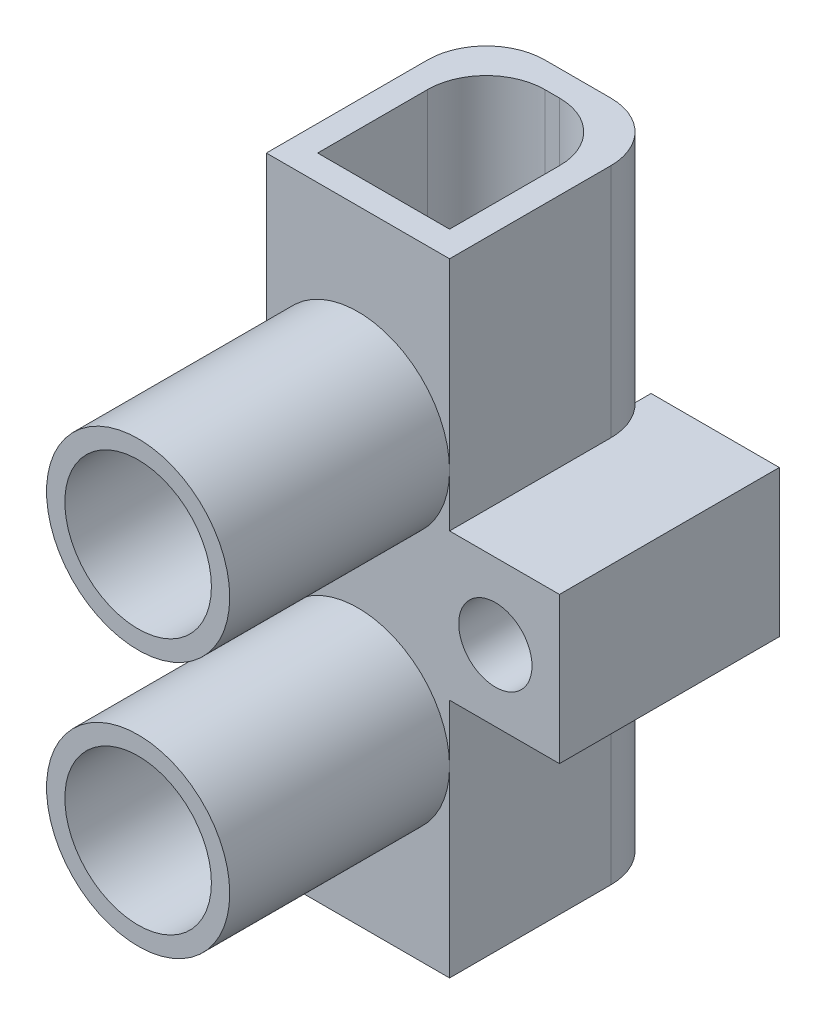
ISO-10303-21;
HEADER;
FILE_DESCRIPTION(('STEP AP214'),'2;1');
FILE_NAME('part.step','',(''),(''),'','','');
FILE_SCHEMA(('AUTOMOTIVE_DESIGN { 1 0 10303 214 1 1 1 1 }'));
ENDSEC;
DATA;
#1=APPLICATION_CONTEXT('core data for automotive mechanical design processes');
#2=APPLICATION_PROTOCOL_DEFINITION('international standard','automotive_design',2000,#1);
#3=PRODUCT_CONTEXT('',#1,'mechanical');
#4=PRODUCT('Part','Part','',(#3));
#5=PRODUCT_RELATED_PRODUCT_CATEGORY('part','',(#4));
#6=PRODUCT_DEFINITION_FORMATION('','',#4);
#7=PRODUCT_DEFINITION_CONTEXT('part definition',#1,'design');
#8=PRODUCT_DEFINITION('design','',#6,#7);
#9=PRODUCT_DEFINITION_SHAPE('','',#8);
#10=(LENGTH_UNIT() NAMED_UNIT(*) SI_UNIT(.MILLI.,.METRE.));
#11=(NAMED_UNIT(*) PLANE_ANGLE_UNIT() SI_UNIT($,.RADIAN.));
#12=(NAMED_UNIT(*) SI_UNIT($,.STERADIAN.) SOLID_ANGLE_UNIT());
#13=UNCERTAINTY_MEASURE_WITH_UNIT(LENGTH_MEASURE(1.E-05),#10,'distance_accuracy_value','');
#14=(GEOMETRIC_REPRESENTATION_CONTEXT(3) GLOBAL_UNCERTAINTY_ASSIGNED_CONTEXT((#13)) GLOBAL_UNIT_ASSIGNED_CONTEXT((#10,
#11,#12)) REPRESENTATION_CONTEXT('',''));
#15=CARTESIAN_POINT('',(0.,0.,0.));
#16=DIRECTION('',(0.,0.,1.));
#17=DIRECTION('',(1.,0.,0.));
#18=AXIS2_PLACEMENT_3D('',#15,#16,#17);
#19=CARTESIAN_POINT('',(4.5,6.56675223188177,-6.));
#20=DIRECTION('',(0.,0.,-1.));
#21=DIRECTION('',(0.,1.,0.));
#22=AXIS2_PLACEMENT_3D('',#19,#20,#21);
#23=PLANE('',#22);
#24=DIRECTION('',(0.,1.,0.));
#25=VECTOR('',#24,1.);
#26=CARTESIAN_POINT('',(4.5,6.56675223188177,-6.));
#27=LINE('',#26,#25);
#28=CARTESIAN_POINT('',(4.5,6.56675223188177,-6.));
#29=VERTEX_POINT('',#28);
#30=CARTESIAN_POINT('',(4.5,10.5667522318818,-6.));
#31=VERTEX_POINT('',#30);
#32=EDGE_CURVE('E11',#29,#31,#27,.T.);
#33=ORIENTED_EDGE('',*,*,#32,.T.);
#34=DIRECTION('',(1.,0.,0.));
#35=VECTOR('',#34,1.);
#36=CARTESIAN_POINT('',(4.5,10.5667522318818,-6.));
#37=LINE('',#36,#35);
#38=CARTESIAN_POINT('',(8.,10.5667522318818,-6.));
#39=VERTEX_POINT('',#38);
#40=EDGE_CURVE('E43',#31,#39,#37,.T.);
#41=ORIENTED_EDGE('',*,*,#40,.T.);
#42=DIRECTION('',(0.,1.,0.));
#43=VECTOR('',#42,1.);
#44=CARTESIAN_POINT('',(8.,6.56675223188177,-6.));
#45=LINE('',#44,#43);
#46=CARTESIAN_POINT('',(8.,6.56675223188177,-6.));
#47=VERTEX_POINT('',#46);
#48=EDGE_CURVE('E217',#47,#39,#45,.T.);
#49=ORIENTED_EDGE('',*,*,#48,.F.);
#50=DIRECTION('',(1.,0.,0.));
#51=VECTOR('',#50,1.);
#52=CARTESIAN_POINT('',(4.5,6.56675223188177,-6.));
#53=LINE('',#52,#51);
#54=EDGE_CURVE('E203',#29,#47,#53,.T.);
#55=ORIENTED_EDGE('',*,*,#54,.F.);
#56=EDGE_LOOP('',(#33,#41,#49,#55));
#57=FACE_BOUND('',#56,.T.);
#58=CARTESIAN_POINT('',(6.25,8.5,-6.));
#59=DIRECTION('',(0.,0.,1.));
#60=DIRECTION('',(1.,0.,0.));
#61=AXIS2_PLACEMENT_3D('',#58,#59,#60);
#62=CIRCLE('',#61,1.);
#63=CARTESIAN_POINT('',(7.25,8.5,-6.));
#64=VERTEX_POINT('',#63);
#65=EDGE_CURVE('E240',#64,#64,#62,.T.);
#66=ORIENTED_EDGE('',*,*,#65,.T.);
#67=EDGE_LOOP('',(#66));
#68=FACE_BOUND('',#67,.T.);
#69=ADVANCED_FACE('F36',(#57,#68),#23,.T.);
#70=CARTESIAN_POINT('',(7.5,0.,0.));
#71=DIRECTION('',(0.,0.,1.));
#72=DIRECTION('',(1.,0.,0.));
#73=AXIS2_PLACEMENT_3D('',#70,#71,#72);
#74=PLANE('',#73);
#75=DIRECTION('',(0.,-1.,0.));
#76=VECTOR('',#75,1.);
#77=CARTESIAN_POINT('',(8.,0.,0.));
#78=LINE('',#77,#76);
#79=CARTESIAN_POINT('',(8.,10.5667522318818,0.));
#80=VERTEX_POINT('',#79);
#81=CARTESIAN_POINT('',(8.,6.56675223188177,0.));
#82=VERTEX_POINT('',#81);
#83=EDGE_CURVE('E206',#80,#82,#78,.T.);
#84=ORIENTED_EDGE('',*,*,#83,.F.);
#85=DIRECTION('',(1.,0.,0.));
#86=VECTOR('',#85,1.);
#87=CARTESIAN_POINT('',(5.,10.5667522318818,0.));
#88=LINE('',#87,#86);
#89=CARTESIAN_POINT('',(5.,10.5667522318818,0.));
#90=VERTEX_POINT('',#89);
#91=EDGE_CURVE('E192',#90,#80,#88,.T.);
#92=ORIENTED_EDGE('',*,*,#91,.F.);
#93=DIRECTION('',(0.,1.,0.));
#94=VECTOR('',#93,1.);
#95=CARTESIAN_POINT('',(5.,10.5667522318818,0.));
#96=LINE('',#95,#94);
#97=CARTESIAN_POINT('',(5.,12.,0.));
#98=VERTEX_POINT('',#97);
#99=EDGE_CURVE('E230',#90,#98,#96,.T.);
#100=ORIENTED_EDGE('',*,*,#99,.T.);
#101=CARTESIAN_POINT('',(2.5,12.,0.));
#102=DIRECTION('',(0.,0.,1.));
#103=DIRECTION('',(-1.,0.,0.));
#104=AXIS2_PLACEMENT_3D('',#101,#102,#103);
#105=CIRCLE('',#104,2.5);
#106=CARTESIAN_POINT('',(0.,12.,0.));
#107=VERTEX_POINT('',#106);
#108=EDGE_CURVE('E221',#107,#98,#105,.T.);
#109=ORIENTED_EDGE('',*,*,#108,.F.);
#110=DIRECTION('',(0.,1.,0.));
#111=VECTOR('',#110,1.);
#112=CARTESIAN_POINT('',(0.,5.,0.));
#113=LINE('',#112,#111);
#114=CARTESIAN_POINT('',(0.,5.,0.));
#115=VERTEX_POINT('',#114);
#116=EDGE_CURVE('E224',#115,#107,#113,.T.);
#117=ORIENTED_EDGE('',*,*,#116,.F.);
#118=CARTESIAN_POINT('',(2.5,5.,0.));
#119=DIRECTION('',(0.,0.,1.));
#120=DIRECTION('',(1.,0.,0.));
#121=AXIS2_PLACEMENT_3D('',#118,#119,#120);
#122=CIRCLE('',#121,2.5);
#123=CARTESIAN_POINT('',(5.,5.,0.));
#124=VERTEX_POINT('',#123);
#125=EDGE_CURVE('E746',#124,#115,#122,.T.);
#126=ORIENTED_EDGE('',*,*,#125,.F.);
#127=DIRECTION('',(0.,1.,0.));
#128=VECTOR('',#127,1.);
#129=CARTESIAN_POINT('',(5.,5.,0.));
#130=LINE('',#129,#128);
#131=CARTESIAN_POINT('',(5.,6.56675223188177,0.));
#132=VERTEX_POINT('',#131);
#133=EDGE_CURVE('E742',#124,#132,#130,.T.);
#134=ORIENTED_EDGE('',*,*,#133,.T.);
#135=DIRECTION('',(1.,0.,0.));
#136=VECTOR('',#135,1.);
#137=CARTESIAN_POINT('',(5.,6.56675223188177,0.));
#138=LINE('',#137,#136);
#139=EDGE_CURVE('E210',#132,#82,#138,.T.);
#140=ORIENTED_EDGE('',*,*,#139,.T.);
#141=EDGE_LOOP('',(#84,#92,#100,#109,#117,#126,#134,#140));
#142=FACE_BOUND('',#141,.T.);
#143=CARTESIAN_POINT('',(6.25,8.5,0.));
#144=DIRECTION('',(0.,0.,1.));
#145=DIRECTION('',(1.,0.,0.));
#146=AXIS2_PLACEMENT_3D('',#143,#144,#145);
#147=CIRCLE('',#146,1.);
#148=CARTESIAN_POINT('',(7.25,8.5,0.));
#149=VERTEX_POINT('',#148);
#150=EDGE_CURVE('E238',#149,#149,#147,.T.);
#151=ORIENTED_EDGE('',*,*,#150,.F.);
#152=EDGE_LOOP('',(#151));
#153=FACE_BOUND('',#152,.T.);
#154=ADVANCED_FACE('F207',(#142,#153),#74,.T.);
#155=CARTESIAN_POINT('',(6.25,8.5,-10.));
#156=DIRECTION('',(0.,0.,1.));
#157=DIRECTION('',(1.,0.,0.));
#158=AXIS2_PLACEMENT_3D('',#155,#156,#157);
#159=CYLINDRICAL_SURFACE('',#158,1.);
#160=ORIENTED_EDGE('',*,*,#150,.T.);
#161=EDGE_LOOP('',(#160));
#162=FACE_BOUND('',#161,.T.);
#163=ORIENTED_EDGE('',*,*,#65,.F.);
#164=EDGE_LOOP('',(#163));
#165=FACE_BOUND('',#164,.T.);
#166=ADVANCED_FACE('F244',(#162,#165),#159,.F.);
#167=CARTESIAN_POINT('',(4.5,0.,0.));
#168=DIRECTION('',(1.,0.,0.));
#169=DIRECTION('',(0.,0.,1.));
#170=AXIS2_PLACEMENT_3D('',#167,#168,#169);
#171=PLANE('',#170);
#172=DIRECTION('',(0.,1.,0.));
#173=VECTOR('',#172,1.);
#174=CARTESIAN_POINT('',(4.5,6.56675223188177,-5.56189500386223));
#175=LINE('',#174,#173);
#176=CARTESIAN_POINT('',(4.5,6.56675223188177,-5.56189500386223));
#177=VERTEX_POINT('',#176);
#178=CARTESIAN_POINT('',(4.5,10.5667522318818,-5.56189500386223));
#179=VERTEX_POINT('',#178);
#180=EDGE_CURVE('E202',#177,#179,#175,.T.);
#181=ORIENTED_EDGE('',*,*,#180,.T.);
#182=DIRECTION('',(0.,0.,1.));
#183=VECTOR('',#182,1.);
#184=CARTESIAN_POINT('',(4.5,10.5667522318818,-6.));
#185=LINE('',#184,#183);
#186=EDGE_CURVE('E232',#31,#179,#185,.T.);
#187=ORIENTED_EDGE('',*,*,#186,.F.);
#188=ORIENTED_EDGE('',*,*,#32,.F.);
#189=DIRECTION('',(0.,0.,-1.));
#190=VECTOR('',#189,1.);
#191=CARTESIAN_POINT('',(4.5,6.56675223188177,-5.56189500386223));
#192=LINE('',#191,#190);
#193=EDGE_CURVE('E219',#177,#29,#192,.T.);
#194=ORIENTED_EDGE('',*,*,#193,.F.);
#195=EDGE_LOOP('',(#181,#187,#188,#194));
#196=FACE_BOUND('',#195,.T.);
#197=ADVANCED_FACE('F246',(#196),#171,.F.);
#198=CARTESIAN_POINT('',(4.5,10.5667522318818,-6.));
#199=DIRECTION('',(0.,1.,0.));
#200=DIRECTION('',(0.,0.,1.));
#201=AXIS2_PLACEMENT_3D('',#198,#199,#200);
#202=PLANE('',#201);
#203=ORIENTED_EDGE('',*,*,#91,.T.);
#204=DIRECTION('',(0.,0.,1.));
#205=VECTOR('',#204,1.);
#206=CARTESIAN_POINT('',(8.,10.5667522318818,-6.));
#207=LINE('',#206,#205);
#208=EDGE_CURVE('E196',#39,#80,#207,.T.);
#209=ORIENTED_EDGE('',*,*,#208,.F.);
#210=ORIENTED_EDGE('',*,*,#40,.F.);
#211=ORIENTED_EDGE('',*,*,#186,.T.);
#212=CARTESIAN_POINT('',(3.4,10.5667522318818,-4.4));
#213=DIRECTION('',(0.,1.,0.));
#214=DIRECTION('',(1.,0.,0.));
#215=AXIS2_PLACEMENT_3D('',#212,#213,#214);
#216=CIRCLE('',#215,1.6);
#217=CARTESIAN_POINT('',(5.,10.5667522318818,-4.4));
#218=VERTEX_POINT('',#217);
#219=EDGE_CURVE('E735',#218,#179,#216,.T.);
#220=ORIENTED_EDGE('',*,*,#219,.F.);
#221=DIRECTION('',(0.,0.,1.));
#222=VECTOR('',#221,1.);
#223=CARTESIAN_POINT('',(5.,10.5667522318818,-4.4));
#224=LINE('',#223,#222);
#225=EDGE_CURVE('E199',#218,#90,#224,.T.);
#226=ORIENTED_EDGE('',*,*,#225,.T.);
#227=EDGE_LOOP('',(#203,#209,#210,#211,#220,#226));
#228=FACE_BOUND('',#227,.T.);
#229=ADVANCED_FACE('F194',(#228),#202,.T.);
#230=CARTESIAN_POINT('',(8.,0.,0.));
#231=DIRECTION('',(1.,0.,0.));
#232=DIRECTION('',(0.,0.,1.));
#233=AXIS2_PLACEMENT_3D('',#230,#231,#232);
#234=PLANE('',#233);
#235=ORIENTED_EDGE('',*,*,#208,.T.);
#236=ORIENTED_EDGE('',*,*,#83,.T.);
#237=DIRECTION('',(0.,0.,-1.));
#238=VECTOR('',#237,1.);
#239=CARTESIAN_POINT('',(8.,6.56675223188177,-5.56189500386223));
#240=LINE('',#239,#238);
#241=EDGE_CURVE('E218',#82,#47,#240,.T.);
#242=ORIENTED_EDGE('',*,*,#241,.T.);
#243=ORIENTED_EDGE('',*,*,#48,.T.);
#244=EDGE_LOOP('',(#235,#236,#242,#243));
#245=FACE_BOUND('',#244,.T.);
#246=ADVANCED_FACE('F216',(#245),#234,.T.);
#247=CARTESIAN_POINT('',(4.5,6.56675223188177,0.));
#248=DIRECTION('',(0.,-1.,0.));
#249=DIRECTION('',(0.,0.,-1.));
#250=AXIS2_PLACEMENT_3D('',#247,#248,#249);
#251=PLANE('',#250);
#252=ORIENTED_EDGE('',*,*,#54,.T.);
#253=ORIENTED_EDGE('',*,*,#241,.F.);
#254=ORIENTED_EDGE('',*,*,#139,.F.);
#255=DIRECTION('',(0.,0.,-1.));
#256=VECTOR('',#255,1.);
#257=CARTESIAN_POINT('',(5.,6.56675223188177,0.));
#258=LINE('',#257,#256);
#259=CARTESIAN_POINT('',(5.,6.56675223188177,-4.4));
#260=VERTEX_POINT('',#259);
#261=EDGE_CURVE('E744',#132,#260,#258,.T.);
#262=ORIENTED_EDGE('',*,*,#261,.T.);
#263=CARTESIAN_POINT('',(3.4,6.56675223188177,-4.4));
#264=DIRECTION('',(0.,1.,0.));
#265=DIRECTION('',(1.,0.,0.));
#266=AXIS2_PLACEMENT_3D('',#263,#264,#265);
#267=CIRCLE('',#266,1.6);
#268=EDGE_CURVE('E738',#260,#177,#267,.T.);
#269=ORIENTED_EDGE('',*,*,#268,.T.);
#270=ORIENTED_EDGE('',*,*,#193,.T.);
#271=EDGE_LOOP('',(#252,#253,#254,#262,#269,#270));
#272=FACE_BOUND('',#271,.T.);
#273=ADVANCED_FACE('F272',(#272),#251,.T.);
#274=CARTESIAN_POINT('',(5.,0.,0.));
#275=DIRECTION('',(1.,0.,0.));
#276=DIRECTION('',(0.,0.,-1.));
#277=AXIS2_PLACEMENT_3D('',#274,#275,#276);
#278=PLANE('',#277);
#279=ORIENTED_EDGE('',*,*,#225,.F.);
#280=DIRECTION('',(0.,1.,0.));
#281=VECTOR('',#280,1.);
#282=CARTESIAN_POINT('',(5.,10.5667522318818,-4.4));
#283=LINE('',#282,#281);
#284=CARTESIAN_POINT('',(5.,17.,-4.4));
#285=VERTEX_POINT('',#284);
#286=EDGE_CURVE('E730',#218,#285,#283,.T.);
#287=ORIENTED_EDGE('',*,*,#286,.T.);
#288=DIRECTION('',(0.,0.,-1.));
#289=VECTOR('',#288,1.);
#290=CARTESIAN_POINT('',(5.,17.,0.));
#291=LINE('',#290,#289);
#292=CARTESIAN_POINT('',(5.,17.,0.));
#293=VERTEX_POINT('',#292);
#294=EDGE_CURVE('E722',#293,#285,#291,.T.);
#295=ORIENTED_EDGE('',*,*,#294,.F.);
#296=DIRECTION('',(0.,1.,0.));
#297=VECTOR('',#296,1.);
#298=CARTESIAN_POINT('',(5.,12.,0.));
#299=LINE('',#298,#297);
#300=EDGE_CURVE('E713',#98,#293,#299,.T.);
#301=ORIENTED_EDGE('',*,*,#300,.F.);
#302=ORIENTED_EDGE('',*,*,#99,.F.);
#303=EDGE_LOOP('',(#279,#287,#295,#301,#302));
#304=FACE_BOUND('',#303,.T.);
#305=ADVANCED_FACE('F294',(#304),#278,.T.);
#306=CARTESIAN_POINT('',(2.5,12.,0.));
#307=DIRECTION('',(0.,0.,1.));
#308=DIRECTION('',(1.,0.,0.));
#309=AXIS2_PLACEMENT_3D('',#306,#307,#308);
#310=CYLINDRICAL_SURFACE('',#309,2.5);
#311=CARTESIAN_POINT('',(2.5,12.,6.));
#312=DIRECTION('',(0.,0.,1.));
#313=DIRECTION('',(1.,0.,0.));
#314=AXIS2_PLACEMENT_3D('',#311,#312,#313);
#315=CIRCLE('',#314,2.5);
#316=CARTESIAN_POINT('',(5.,12.,6.));
#317=VERTEX_POINT('',#316);
#318=EDGE_CURVE('E732',#317,#317,#315,.T.);
#319=ORIENTED_EDGE('',*,*,#318,.F.);
#320=EDGE_LOOP('',(#319));
#321=FACE_BOUND('',#320,.T.);
#322=CARTESIAN_POINT('',(2.5,12.,0.));
#323=DIRECTION('',(0.,0.,1.));
#324=DIRECTION('',(1.,0.,0.));
#325=AXIS2_PLACEMENT_3D('',#322,#323,#324);
#326=CIRCLE('',#325,2.5);
#327=EDGE_CURVE('E725',#98,#107,#326,.T.);
#328=ORIENTED_EDGE('',*,*,#327,.T.);
#329=ORIENTED_EDGE('',*,*,#108,.T.);
#330=EDGE_LOOP('',(#328,#329));
#331=FACE_BOUND('',#330,.T.);
#332=ADVANCED_FACE('F300',(#321,#331),#310,.T.);
#333=CARTESIAN_POINT('',(0.,0.,-4.4));
#334=DIRECTION('',(-1.,0.,0.));
#335=DIRECTION('',(0.,0.,1.));
#336=AXIS2_PLACEMENT_3D('',#333,#334,#335);
#337=PLANE('',#336);
#338=DIRECTION('',(0.,0.,1.));
#339=VECTOR('',#338,1.);
#340=CARTESIAN_POINT('',(0.,0.,-4.4));
#341=LINE('',#340,#339);
#342=CARTESIAN_POINT('',(0.,0.,-4.4));
#343=VERTEX_POINT('',#342);
#344=CARTESIAN_POINT('',(0.,0.,0.));
#345=VERTEX_POINT('',#344);
#346=EDGE_CURVE('E728',#343,#345,#341,.T.);
#347=ORIENTED_EDGE('',*,*,#346,.T.);
#348=DIRECTION('',(0.,1.,0.));
#349=VECTOR('',#348,1.);
#350=CARTESIAN_POINT('',(0.,0.,0.));
#351=LINE('',#350,#349);
#352=EDGE_CURVE('E716',#345,#115,#351,.T.);
#353=ORIENTED_EDGE('',*,*,#352,.T.);
#354=ORIENTED_EDGE('',*,*,#116,.T.);
#355=DIRECTION('',(0.,1.,0.));
#356=VECTOR('',#355,1.);
#357=CARTESIAN_POINT('',(0.,12.,0.));
#358=LINE('',#357,#356);
#359=CARTESIAN_POINT('',(0.,17.,0.));
#360=VERTEX_POINT('',#359);
#361=EDGE_CURVE('E708',#107,#360,#358,.T.);
#362=ORIENTED_EDGE('',*,*,#361,.T.);
#363=DIRECTION('',(0.,0.,1.));
#364=VECTOR('',#363,1.);
#365=CARTESIAN_POINT('',(0.,17.,-4.4));
#366=LINE('',#365,#364);
#367=CARTESIAN_POINT('',(0.,17.,-4.4));
#368=VERTEX_POINT('',#367);
#369=EDGE_CURVE('E702',#368,#360,#366,.T.);
#370=ORIENTED_EDGE('',*,*,#369,.F.);
#371=DIRECTION('',(0.,1.,0.));
#372=VECTOR('',#371,1.);
#373=CARTESIAN_POINT('',(0.,0.,-4.4));
#374=LINE('',#373,#372);
#375=EDGE_CURVE('E697',#343,#368,#374,.T.);
#376=ORIENTED_EDGE('',*,*,#375,.F.);
#377=EDGE_LOOP('',(#347,#353,#354,#362,#370,#376));
#378=FACE_BOUND('',#377,.T.);
#379=ADVANCED_FACE('F310',(#378),#337,.T.);
#380=CARTESIAN_POINT('',(2.5,5.,0.));
#381=DIRECTION('',(0.,0.,1.));
#382=DIRECTION('',(1.,0.,0.));
#383=AXIS2_PLACEMENT_3D('',#380,#381,#382);
#384=CYLINDRICAL_SURFACE('',#383,2.5);
#385=CARTESIAN_POINT('',(2.5,5.,6.));
#386=DIRECTION('',(0.,0.,1.));
#387=DIRECTION('',(1.,0.,0.));
#388=AXIS2_PLACEMENT_3D('',#385,#386,#387);
#389=CIRCLE('',#388,2.5);
#390=CARTESIAN_POINT('',(5.,5.,6.));
#391=VERTEX_POINT('',#390);
#392=EDGE_CURVE('E719',#391,#391,#389,.T.);
#393=ORIENTED_EDGE('',*,*,#392,.F.);
#394=EDGE_LOOP('',(#393));
#395=FACE_BOUND('',#394,.T.);
#396=ORIENTED_EDGE('',*,*,#125,.T.);
#397=CARTESIAN_POINT('',(2.5,5.,0.));
#398=DIRECTION('',(0.,0.,1.));
#399=DIRECTION('',(-1.,0.,0.));
#400=AXIS2_PLACEMENT_3D('',#397,#398,#399);
#401=CIRCLE('',#400,2.5);
#402=EDGE_CURVE('E710',#115,#124,#401,.T.);
#403=ORIENTED_EDGE('',*,*,#402,.T.);
#404=EDGE_LOOP('',(#396,#403));
#405=FACE_BOUND('',#404,.T.);
#406=ADVANCED_FACE('F319',(#395,#405),#384,.T.);
#407=CARTESIAN_POINT('',(5.,0.,0.));
#408=DIRECTION('',(1.,0.,0.));
#409=DIRECTION('',(0.,0.,-1.));
#410=AXIS2_PLACEMENT_3D('',#407,#408,#409);
#411=PLANE('',#410);
#412=ORIENTED_EDGE('',*,*,#261,.F.);
#413=ORIENTED_EDGE('',*,*,#133,.F.);
#414=DIRECTION('',(0.,1.,0.));
#415=VECTOR('',#414,1.);
#416=CARTESIAN_POINT('',(5.,0.,0.));
#417=LINE('',#416,#415);
#418=CARTESIAN_POINT('',(5.,0.,0.));
#419=VERTEX_POINT('',#418);
#420=EDGE_CURVE('E705',#419,#124,#417,.T.);
#421=ORIENTED_EDGE('',*,*,#420,.F.);
#422=DIRECTION('',(0.,0.,-1.));
#423=VECTOR('',#422,1.);
#424=CARTESIAN_POINT('',(5.,0.,0.));
#425=LINE('',#424,#423);
#426=CARTESIAN_POINT('',(5.,0.,-4.4));
#427=VERTEX_POINT('',#426);
#428=EDGE_CURVE('E700',#419,#427,#425,.T.);
#429=ORIENTED_EDGE('',*,*,#428,.T.);
#430=DIRECTION('',(0.,1.,0.));
#431=VECTOR('',#430,1.);
#432=CARTESIAN_POINT('',(5.,0.,-4.4));
#433=LINE('',#432,#431);
#434=EDGE_CURVE('E694',#427,#260,#433,.T.);
#435=ORIENTED_EDGE('',*,*,#434,.T.);
#436=EDGE_LOOP('',(#412,#413,#421,#429,#435));
#437=FACE_BOUND('',#436,.T.);
#438=ADVANCED_FACE('F328',(#437),#411,.T.);
#439=CARTESIAN_POINT('',(3.4,0.,-4.4));
#440=DIRECTION('',(0.,1.,0.));
#441=DIRECTION('',(1.,0.,0.));
#442=AXIS2_PLACEMENT_3D('',#439,#440,#441);
#443=CYLINDRICAL_SURFACE('',#442,1.6);
#444=ORIENTED_EDGE('',*,*,#268,.F.);
#445=ORIENTED_EDGE('',*,*,#434,.F.);
#446=CARTESIAN_POINT('',(3.4,0.,-4.4));
#447=DIRECTION('',(0.,1.,0.));
#448=DIRECTION('',(1.,0.,0.));
#449=AXIS2_PLACEMENT_3D('',#446,#447,#448);
#450=CIRCLE('',#449,1.6);
#451=CARTESIAN_POINT('',(3.4,0.,-6.));
#452=VERTEX_POINT('',#451);
#453=EDGE_CURVE('E692',#427,#452,#450,.T.);
#454=ORIENTED_EDGE('',*,*,#453,.T.);
#455=DIRECTION('',(0.,1.,0.));
#456=VECTOR('',#455,1.);
#457=CARTESIAN_POINT('',(3.4,0.,-6.));
#458=LINE('',#457,#456);
#459=CARTESIAN_POINT('',(3.4,17.,-6.));
#460=VERTEX_POINT('',#459);
#461=EDGE_CURVE('E690',#452,#460,#458,.T.);
#462=ORIENTED_EDGE('',*,*,#461,.T.);
#463=CARTESIAN_POINT('',(3.4,17.,-4.4));
#464=DIRECTION('',(0.,1.,0.));
#465=DIRECTION('',(1.,0.,0.));
#466=AXIS2_PLACEMENT_3D('',#463,#464,#465);
#467=CIRCLE('',#466,1.6);
#468=EDGE_CURVE('E687',#285,#460,#467,.T.);
#469=ORIENTED_EDGE('',*,*,#468,.F.);
#470=ORIENTED_EDGE('',*,*,#286,.F.);
#471=ORIENTED_EDGE('',*,*,#219,.T.);
#472=ORIENTED_EDGE('',*,*,#180,.F.);
#473=EDGE_LOOP('',(#444,#445,#454,#462,#469,#470,#471,#472));
#474=FACE_BOUND('',#473,.T.);
#475=ADVANCED_FACE('F337',(#474),#443,.T.);
#476=CARTESIAN_POINT('',(0.,17.,0.));
#477=DIRECTION('',(0.,1.,0.));
#478=DIRECTION('',(1.,0.,0.));
#479=AXIS2_PLACEMENT_3D('',#476,#477,#478);
#480=PLANE('',#479);
#481=DIRECTION('',(-1.,0.,0.));
#482=VECTOR('',#481,1.);
#483=CARTESIAN_POINT('',(3.4,17.,-6.));
#484=LINE('',#483,#482);
#485=CARTESIAN_POINT('',(1.6,17.,-6.));
#486=VERTEX_POINT('',#485);
#487=EDGE_CURVE('E685',#460,#486,#484,.T.);
#488=ORIENTED_EDGE('',*,*,#487,.T.);
#489=CARTESIAN_POINT('',(1.6,17.,-4.4));
#490=DIRECTION('',(0.,1.,0.));
#491=DIRECTION('',(0.,0.,-1.));
#492=AXIS2_PLACEMENT_3D('',#489,#490,#491);
#493=CIRCLE('',#492,1.6);
#494=EDGE_CURVE('E682',#486,#368,#493,.T.);
#495=ORIENTED_EDGE('',*,*,#494,.T.);
#496=ORIENTED_EDGE('',*,*,#369,.T.);
#497=DIRECTION('',(1.,0.,0.));
#498=VECTOR('',#497,1.);
#499=CARTESIAN_POINT('',(0.,17.,0.));
#500=LINE('',#499,#498);
#501=EDGE_CURVE('E670',#360,#293,#500,.T.);
#502=ORIENTED_EDGE('',*,*,#501,.T.);
#503=ORIENTED_EDGE('',*,*,#294,.T.);
#504=ORIENTED_EDGE('',*,*,#468,.T.);
#505=EDGE_LOOP('',(#488,#495,#496,#502,#503,#504));
#506=FACE_BOUND('',#505,.T.);
#507=DIRECTION('',(-1.,0.,0.));
#508=VECTOR('',#507,1.);
#509=CARTESIAN_POINT('',(2.7,17.,-5.3));
#510=LINE('',#509,#508);
#511=CARTESIAN_POINT('',(2.7,17.,-5.3));
#512=VERTEX_POINT('',#511);
#513=CARTESIAN_POINT('',(2.3,17.,-5.3));
#514=VERTEX_POINT('',#513);
#515=EDGE_CURVE('E679',#512,#514,#510,.T.);
#516=ORIENTED_EDGE('',*,*,#515,.F.);
#517=CARTESIAN_POINT('',(2.7,17.,-3.7));
#518=DIRECTION('',(0.,1.,0.));
#519=DIRECTION('',(1.,0.,0.));
#520=AXIS2_PLACEMENT_3D('',#517,#518,#519);
#521=CIRCLE('',#520,1.6);
#522=CARTESIAN_POINT('',(4.3,17.,-3.7));
#523=VERTEX_POINT('',#522);
#524=EDGE_CURVE('E676',#523,#512,#521,.T.);
#525=ORIENTED_EDGE('',*,*,#524,.F.);
#526=DIRECTION('',(0.,0.,-1.));
#527=VECTOR('',#526,1.);
#528=CARTESIAN_POINT('',(4.3,17.,-0.7));
#529=LINE('',#528,#527);
#530=CARTESIAN_POINT('',(4.3,17.,-0.7));
#531=VERTEX_POINT('',#530);
#532=EDGE_CURVE('E667',#531,#523,#529,.T.);
#533=ORIENTED_EDGE('',*,*,#532,.F.);
#534=DIRECTION('',(1.,0.,0.));
#535=VECTOR('',#534,1.);
#536=CARTESIAN_POINT('',(0.7,17.,-0.7));
#537=LINE('',#536,#535);
#538=CARTESIAN_POINT('',(0.7,17.,-0.7));
#539=VERTEX_POINT('',#538);
#540=EDGE_CURVE('E662',#539,#531,#537,.T.);
#541=ORIENTED_EDGE('',*,*,#540,.F.);
#542=DIRECTION('',(0.,0.,1.));
#543=VECTOR('',#542,1.);
#544=CARTESIAN_POINT('',(0.7,17.,-3.7));
#545=LINE('',#544,#543);
#546=CARTESIAN_POINT('',(0.7,17.,-3.7));
#547=VERTEX_POINT('',#546);
#548=EDGE_CURVE('E651',#547,#539,#545,.T.);
#549=ORIENTED_EDGE('',*,*,#548,.F.);
#550=CARTESIAN_POINT('',(2.3,17.,-3.7));
#551=DIRECTION('',(0.,1.,0.));
#552=DIRECTION('',(0.,0.,-1.));
#553=AXIS2_PLACEMENT_3D('',#550,#551,#552);
#554=CIRCLE('',#553,1.6);
#555=EDGE_CURVE('E646',#514,#547,#554,.T.);
#556=ORIENTED_EDGE('',*,*,#555,.F.);
#557=EDGE_LOOP('',(#516,#525,#533,#541,#549,#556));
#558=FACE_BOUND('',#557,.T.);
#559=ADVANCED_FACE('F347',(#506,#558),#480,.T.);
#560=CARTESIAN_POINT('',(0.,0.,0.));
#561=DIRECTION('',(0.,0.,1.));
#562=DIRECTION('',(1.,0.,0.));
#563=AXIS2_PLACEMENT_3D('',#560,#561,#562);
#564=PLANE('',#563);
#565=ORIENTED_EDGE('',*,*,#327,.F.);
#566=ORIENTED_EDGE('',*,*,#300,.T.);
#567=ORIENTED_EDGE('',*,*,#501,.F.);
#568=ORIENTED_EDGE('',*,*,#361,.F.);
#569=EDGE_LOOP('',(#565,#566,#567,#568));
#570=FACE_BOUND('',#569,.T.);
#571=ADVANCED_FACE('F356',(#570),#564,.T.);
#572=CARTESIAN_POINT('',(0.,0.,6.));
#573=DIRECTION('',(0.,0.,1.));
#574=DIRECTION('',(1.,0.,0.));
#575=AXIS2_PLACEMENT_3D('',#572,#573,#574);
#576=PLANE('',#575);
#577=ORIENTED_EDGE('',*,*,#318,.T.);
#578=EDGE_LOOP('',(#577));
#579=FACE_BOUND('',#578,.T.);
#580=CARTESIAN_POINT('',(2.5,12.,6.));
#581=DIRECTION('',(0.,0.,1.));
#582=DIRECTION('',(1.,0.,0.));
#583=AXIS2_PLACEMENT_3D('',#580,#581,#582);
#584=CIRCLE('',#583,2.);
#585=CARTESIAN_POINT('',(4.5,12.,6.));
#586=VERTEX_POINT('',#585);
#587=EDGE_CURVE('E673',#586,#586,#584,.T.);
#588=ORIENTED_EDGE('',*,*,#587,.F.);
#589=EDGE_LOOP('',(#588));
#590=FACE_BOUND('',#589,.T.);
#591=ADVANCED_FACE('F366',(#579,#590),#576,.T.);
#592=CARTESIAN_POINT('',(0.,0.,0.));
#593=DIRECTION('',(0.,1.,0.));
#594=DIRECTION('',(1.,0.,0.));
#595=AXIS2_PLACEMENT_3D('',#592,#593,#594);
#596=PLANE('',#595);
#597=ORIENTED_EDGE('',*,*,#453,.F.);
#598=ORIENTED_EDGE('',*,*,#428,.F.);
#599=DIRECTION('',(1.,0.,0.));
#600=VECTOR('',#599,1.);
#601=CARTESIAN_POINT('',(0.,0.,0.));
#602=LINE('',#601,#600);
#603=EDGE_CURVE('E656',#345,#419,#602,.T.);
#604=ORIENTED_EDGE('',*,*,#603,.F.);
#605=ORIENTED_EDGE('',*,*,#346,.F.);
#606=CARTESIAN_POINT('',(1.6,0.,-4.4));
#607=DIRECTION('',(0.,1.,0.));
#608=DIRECTION('',(0.,0.,-1.));
#609=AXIS2_PLACEMENT_3D('',#606,#607,#608);
#610=CIRCLE('',#609,1.6);
#611=CARTESIAN_POINT('',(1.6,0.,-6.));
#612=VERTEX_POINT('',#611);
#613=EDGE_CURVE('E659',#612,#343,#610,.T.);
#614=ORIENTED_EDGE('',*,*,#613,.F.);
#615=DIRECTION('',(-1.,0.,0.));
#616=VECTOR('',#615,1.);
#617=CARTESIAN_POINT('',(3.4,0.,-6.));
#618=LINE('',#617,#616);
#619=EDGE_CURVE('E635',#452,#612,#618,.T.);
#620=ORIENTED_EDGE('',*,*,#619,.F.);
#621=EDGE_LOOP('',(#597,#598,#604,#605,#614,#620));
#622=FACE_BOUND('',#621,.T.);
#623=DIRECTION('',(-1.,0.,0.));
#624=VECTOR('',#623,1.);
#625=CARTESIAN_POINT('',(2.7,0.,-5.3));
#626=LINE('',#625,#624);
#627=CARTESIAN_POINT('',(2.7,0.,-5.3));
#628=VERTEX_POINT('',#627);
#629=CARTESIAN_POINT('',(2.3,0.,-5.3));
#630=VERTEX_POINT('',#629);
#631=EDGE_CURVE('E665',#628,#630,#626,.T.);
#632=ORIENTED_EDGE('',*,*,#631,.T.);
#633=CARTESIAN_POINT('',(2.3,0.,-3.7));
#634=DIRECTION('',(0.,1.,0.));
#635=DIRECTION('',(0.,0.,-1.));
#636=AXIS2_PLACEMENT_3D('',#633,#634,#635);
#637=CIRCLE('',#636,1.6);
#638=CARTESIAN_POINT('',(0.7,0.,-3.7));
#639=VERTEX_POINT('',#638);
#640=EDGE_CURVE('E654',#630,#639,#637,.T.);
#641=ORIENTED_EDGE('',*,*,#640,.T.);
#642=DIRECTION('',(0.,0.,1.));
#643=VECTOR('',#642,1.);
#644=CARTESIAN_POINT('',(0.7,0.,-3.7));
#645=LINE('',#644,#643);
#646=CARTESIAN_POINT('',(0.7,0.,-0.7));
#647=VERTEX_POINT('',#646);
#648=EDGE_CURVE('E649',#639,#647,#645,.T.);
#649=ORIENTED_EDGE('',*,*,#648,.T.);
#650=DIRECTION('',(1.,0.,0.));
#651=VECTOR('',#650,1.);
#652=CARTESIAN_POINT('',(0.7,0.,-0.7));
#653=LINE('',#652,#651);
#654=CARTESIAN_POINT('',(4.3,0.,-0.7));
#655=VERTEX_POINT('',#654);
#656=EDGE_CURVE('E641',#647,#655,#653,.T.);
#657=ORIENTED_EDGE('',*,*,#656,.T.);
#658=DIRECTION('',(0.,0.,-1.));
#659=VECTOR('',#658,1.);
#660=CARTESIAN_POINT('',(4.3,0.,-0.7));
#661=LINE('',#660,#659);
#662=CARTESIAN_POINT('',(4.3,0.,-3.7));
#663=VERTEX_POINT('',#662);
#664=EDGE_CURVE('E633',#655,#663,#661,.T.);
#665=ORIENTED_EDGE('',*,*,#664,.T.);
#666=CARTESIAN_POINT('',(2.7,0.,-3.7));
#667=DIRECTION('',(0.,1.,0.));
#668=DIRECTION('',(1.,0.,0.));
#669=AXIS2_PLACEMENT_3D('',#666,#667,#668);
#670=CIRCLE('',#669,1.6);
#671=EDGE_CURVE('E631',#663,#628,#670,.T.);
#672=ORIENTED_EDGE('',*,*,#671,.T.);
#673=EDGE_LOOP('',(#632,#641,#649,#657,#665,#672));
#674=FACE_BOUND('',#673,.T.);
#675=ADVANCED_FACE('F375',(#622,#674),#596,.F.);
#676=CARTESIAN_POINT('',(0.,0.,0.));
#677=DIRECTION('',(0.,0.,1.));
#678=DIRECTION('',(1.,0.,0.));
#679=AXIS2_PLACEMENT_3D('',#676,#677,#678);
#680=PLANE('',#679);
#681=ORIENTED_EDGE('',*,*,#402,.F.);
#682=ORIENTED_EDGE('',*,*,#352,.F.);
#683=ORIENTED_EDGE('',*,*,#603,.T.);
#684=ORIENTED_EDGE('',*,*,#420,.T.);
#685=EDGE_LOOP('',(#681,#682,#683,#684));
#686=FACE_BOUND('',#685,.T.);
#687=ADVANCED_FACE('F383',(#686),#680,.T.);
#688=CARTESIAN_POINT('',(1.6,0.,-4.4));
#689=DIRECTION('',(0.,1.,0.));
#690=DIRECTION('',(0.,0.,-1.));
#691=AXIS2_PLACEMENT_3D('',#688,#689,#690);
#692=CYLINDRICAL_SURFACE('',#691,1.6);
#693=ORIENTED_EDGE('',*,*,#613,.T.);
#694=ORIENTED_EDGE('',*,*,#375,.T.);
#695=ORIENTED_EDGE('',*,*,#494,.F.);
#696=DIRECTION('',(0.,1.,0.));
#697=VECTOR('',#696,1.);
#698=CARTESIAN_POINT('',(1.6,0.,-6.));
#699=LINE('',#698,#697);
#700=EDGE_CURVE('E638',#612,#486,#699,.T.);
#701=ORIENTED_EDGE('',*,*,#700,.F.);
#702=EDGE_LOOP('',(#693,#694,#695,#701));
#703=FACE_BOUND('',#702,.T.);
#704=ADVANCED_FACE('F391',(#703),#692,.T.);
#705=CARTESIAN_POINT('',(0.,0.,6.));
#706=DIRECTION('',(0.,0.,1.));
#707=DIRECTION('',(1.,0.,0.));
#708=AXIS2_PLACEMENT_3D('',#705,#706,#707);
#709=PLANE('',#708);
#710=ORIENTED_EDGE('',*,*,#392,.T.);
#711=EDGE_LOOP('',(#710));
#712=FACE_BOUND('',#711,.T.);
#713=CARTESIAN_POINT('',(2.5,5.,6.));
#714=DIRECTION('',(0.,0.,1.));
#715=DIRECTION('',(1.,0.,0.));
#716=AXIS2_PLACEMENT_3D('',#713,#714,#715);
#717=CIRCLE('',#716,2.);
#718=CARTESIAN_POINT('',(4.5,5.,6.));
#719=VERTEX_POINT('',#718);
#720=EDGE_CURVE('E643',#719,#719,#717,.T.);
#721=ORIENTED_EDGE('',*,*,#720,.F.);
#722=EDGE_LOOP('',(#721));
#723=FACE_BOUND('',#722,.T.);
#724=ADVANCED_FACE('F400',(#712,#723),#709,.T.);
#725=CARTESIAN_POINT('',(3.4,0.,-6.));
#726=DIRECTION('',(0.,0.,-1.));
#727=DIRECTION('',(-1.,0.,0.));
#728=AXIS2_PLACEMENT_3D('',#725,#726,#727);
#729=PLANE('',#728);
#730=ORIENTED_EDGE('',*,*,#619,.T.);
#731=ORIENTED_EDGE('',*,*,#700,.T.);
#732=ORIENTED_EDGE('',*,*,#487,.F.);
#733=ORIENTED_EDGE('',*,*,#461,.F.);
#734=EDGE_LOOP('',(#730,#731,#732,#733));
#735=FACE_BOUND('',#734,.T.);
#736=ADVANCED_FACE('F409',(#735),#729,.T.);
#737=CARTESIAN_POINT('',(2.7,0.,-5.3));
#738=DIRECTION('',(0.,0.,-1.));
#739=DIRECTION('',(-1.,0.,0.));
#740=AXIS2_PLACEMENT_3D('',#737,#738,#739);
#741=PLANE('',#740);
#742=ORIENTED_EDGE('',*,*,#515,.T.);
#743=DIRECTION('',(0.,1.,0.));
#744=VECTOR('',#743,1.);
#745=CARTESIAN_POINT('',(2.3,0.,-5.3));
#746=LINE('',#745,#744);
#747=EDGE_CURVE('E628',#630,#514,#746,.T.);
#748=ORIENTED_EDGE('',*,*,#747,.F.);
#749=ORIENTED_EDGE('',*,*,#631,.F.);
#750=DIRECTION('',(0.,1.,0.));
#751=VECTOR('',#750,1.);
#752=CARTESIAN_POINT('',(2.7,0.,-5.3));
#753=LINE('',#752,#751);
#754=EDGE_CURVE('E625',#628,#512,#753,.T.);
#755=ORIENTED_EDGE('',*,*,#754,.T.);
#756=EDGE_LOOP('',(#742,#748,#749,#755));
#757=FACE_BOUND('',#756,.T.);
#758=ADVANCED_FACE('F418',(#757),#741,.F.);
#759=CARTESIAN_POINT('',(2.7,0.,-3.7));
#760=DIRECTION('',(0.,1.,0.));
#761=DIRECTION('',(1.,0.,0.));
#762=AXIS2_PLACEMENT_3D('',#759,#760,#761);
#763=CYLINDRICAL_SURFACE('',#762,1.6);
#764=ORIENTED_EDGE('',*,*,#524,.T.);
#765=ORIENTED_EDGE('',*,*,#754,.F.);
#766=ORIENTED_EDGE('',*,*,#671,.F.);
#767=DIRECTION('',(0.,1.,0.));
#768=VECTOR('',#767,1.);
#769=CARTESIAN_POINT('',(4.3,0.,-3.7));
#770=LINE('',#769,#768);
#771=EDGE_CURVE('E622',#663,#523,#770,.T.);
#772=ORIENTED_EDGE('',*,*,#771,.T.);
#773=EDGE_LOOP('',(#764,#765,#766,#772));
#774=FACE_BOUND('',#773,.T.);
#775=ADVANCED_FACE('F427',(#774),#763,.F.);
#776=CARTESIAN_POINT('',(4.3,0.,-0.7));
#777=DIRECTION('',(1.,0.,0.));
#778=DIRECTION('',(0.,0.,-1.));
#779=AXIS2_PLACEMENT_3D('',#776,#777,#778);
#780=PLANE('',#779);
#781=ORIENTED_EDGE('',*,*,#532,.T.);
#782=ORIENTED_EDGE('',*,*,#771,.F.);
#783=ORIENTED_EDGE('',*,*,#664,.F.);
#784=DIRECTION('',(0.,1.,0.));
#785=VECTOR('',#784,1.);
#786=CARTESIAN_POINT('',(4.3,0.,-0.7));
#787=LINE('',#786,#785);
#788=EDGE_CURVE('E619',#655,#531,#787,.T.);
#789=ORIENTED_EDGE('',*,*,#788,.T.);
#790=EDGE_LOOP('',(#781,#782,#783,#789));
#791=FACE_BOUND('',#790,.T.);
#792=ADVANCED_FACE('F436',(#791),#780,.F.);
#793=CARTESIAN_POINT('',(0.7,0.,-0.7));
#794=DIRECTION('',(0.,0.,1.));
#795=DIRECTION('',(1.,0.,0.));
#796=AXIS2_PLACEMENT_3D('',#793,#794,#795);
#797=PLANE('',#796);
#798=ORIENTED_EDGE('',*,*,#540,.T.);
#799=ORIENTED_EDGE('',*,*,#788,.F.);
#800=ORIENTED_EDGE('',*,*,#656,.F.);
#801=DIRECTION('',(0.,1.,0.));
#802=VECTOR('',#801,1.);
#803=CARTESIAN_POINT('',(0.7,0.,-0.7));
#804=LINE('',#803,#802);
#805=EDGE_CURVE('E616',#647,#539,#804,.T.);
#806=ORIENTED_EDGE('',*,*,#805,.T.);
#807=EDGE_LOOP('',(#798,#799,#800,#806));
#808=FACE_BOUND('',#807,.T.);
#809=ADVANCED_FACE('F445',(#808),#797,.F.);
#810=CARTESIAN_POINT('',(0.7,0.,-3.7));
#811=DIRECTION('',(-1.,0.,0.));
#812=DIRECTION('',(0.,0.,1.));
#813=AXIS2_PLACEMENT_3D('',#810,#811,#812);
#814=PLANE('',#813);
#815=ORIENTED_EDGE('',*,*,#548,.T.);
#816=ORIENTED_EDGE('',*,*,#805,.F.);
#817=ORIENTED_EDGE('',*,*,#648,.F.);
#818=DIRECTION('',(0.,1.,0.));
#819=VECTOR('',#818,1.);
#820=CARTESIAN_POINT('',(0.7,0.,-3.7));
#821=LINE('',#820,#819);
#822=EDGE_CURVE('E611',#639,#547,#821,.T.);
#823=ORIENTED_EDGE('',*,*,#822,.T.);
#824=EDGE_LOOP('',(#815,#816,#817,#823));
#825=FACE_BOUND('',#824,.T.);
#826=ADVANCED_FACE('F454',(#825),#814,.F.);
#827=CARTESIAN_POINT('',(2.3,0.,-3.7));
#828=DIRECTION('',(0.,1.,0.));
#829=DIRECTION('',(0.,0.,-1.));
#830=AXIS2_PLACEMENT_3D('',#827,#828,#829);
#831=CYLINDRICAL_SURFACE('',#830,1.6);
#832=ORIENTED_EDGE('',*,*,#555,.T.);
#833=ORIENTED_EDGE('',*,*,#822,.F.);
#834=ORIENTED_EDGE('',*,*,#640,.F.);
#835=ORIENTED_EDGE('',*,*,#747,.T.);
#836=EDGE_LOOP('',(#832,#833,#834,#835));
#837=FACE_BOUND('',#836,.T.);
#838=ADVANCED_FACE('F463',(#837),#831,.F.);
#839=CARTESIAN_POINT('',(2.5,12.,0.));
#840=DIRECTION('',(0.,0.,1.));
#841=DIRECTION('',(1.,0.,0.));
#842=AXIS2_PLACEMENT_3D('',#839,#840,#841);
#843=CYLINDRICAL_SURFACE('',#842,2.);
#844=ORIENTED_EDGE('',*,*,#587,.T.);
#845=EDGE_LOOP('',(#844));
#846=FACE_BOUND('',#845,.T.);
#847=CARTESIAN_POINT('',(2.5,12.,0.));
#848=DIRECTION('',(0.,0.,1.));
#849=DIRECTION('',(1.,0.,0.));
#850=AXIS2_PLACEMENT_3D('',#847,#848,#849);
#851=CIRCLE('',#850,2.);
#852=CARTESIAN_POINT('',(4.5,12.,0.));
#853=VERTEX_POINT('',#852);
#854=EDGE_CURVE('E608',#853,#853,#851,.T.);
#855=ORIENTED_EDGE('',*,*,#854,.F.);
#856=EDGE_LOOP('',(#855));
#857=FACE_BOUND('',#856,.T.);
#858=ADVANCED_FACE('F472',(#846,#857),#843,.F.);
#859=CARTESIAN_POINT('',(2.5,5.,0.));
#860=DIRECTION('',(0.,0.,1.));
#861=DIRECTION('',(1.,0.,0.));
#862=AXIS2_PLACEMENT_3D('',#859,#860,#861);
#863=CYLINDRICAL_SURFACE('',#862,2.);
#864=ORIENTED_EDGE('',*,*,#720,.T.);
#865=EDGE_LOOP('',(#864));
#866=FACE_BOUND('',#865,.T.);
#867=CARTESIAN_POINT('',(2.5,5.,0.));
#868=DIRECTION('',(0.,0.,1.));
#869=DIRECTION('',(1.,0.,0.));
#870=AXIS2_PLACEMENT_3D('',#867,#868,#869);
#871=CIRCLE('',#870,2.);
#872=CARTESIAN_POINT('',(4.5,5.,0.));
#873=VERTEX_POINT('',#872);
#874=EDGE_CURVE('E214',#873,#873,#871,.T.);
#875=ORIENTED_EDGE('',*,*,#874,.F.);
#876=EDGE_LOOP('',(#875));
#877=FACE_BOUND('',#876,.T.);
#878=ADVANCED_FACE('F481',(#866,#877),#863,.F.);
#879=CARTESIAN_POINT('',(0.,0.,0.));
#880=DIRECTION('',(0.,0.,1.));
#881=DIRECTION('',(1.,0.,0.));
#882=AXIS2_PLACEMENT_3D('',#879,#880,#881);
#883=PLANE('',#882);
#884=ORIENTED_EDGE('',*,*,#854,.T.);
#885=EDGE_LOOP('',(#884));
#886=FACE_BOUND('',#885,.T.);
#887=ADVANCED_FACE('F490',(#886),#883,.T.);
#888=CARTESIAN_POINT('',(0.,0.,0.));
#889=DIRECTION('',(0.,0.,1.));
#890=DIRECTION('',(1.,0.,0.));
#891=AXIS2_PLACEMENT_3D('',#888,#889,#890);
#892=PLANE('',#891);
#893=ORIENTED_EDGE('',*,*,#874,.T.);
#894=EDGE_LOOP('',(#893));
#895=FACE_BOUND('',#894,.T.);
#896=ADVANCED_FACE('F499',(#895),#892,.T.);
#897=CLOSED_SHELL('',(#69,#154,#166,#197,#229,#246,#273,#305,#332,#379,#406,#438,#475,#559,#571,
#591,#675,#687,#704,#724,#736,#758,#775,#792,#809,#826,#838,#858,#878,#887,#896));
#898=MANIFOLD_SOLID_BREP('B2',#897);
#899=ADVANCED_BREP_SHAPE_REPRESENTATION('',(#18,#898),#14);
#900=SHAPE_DEFINITION_REPRESENTATION(#9,#899);
ENDSEC;
END-ISO-10303-21;
